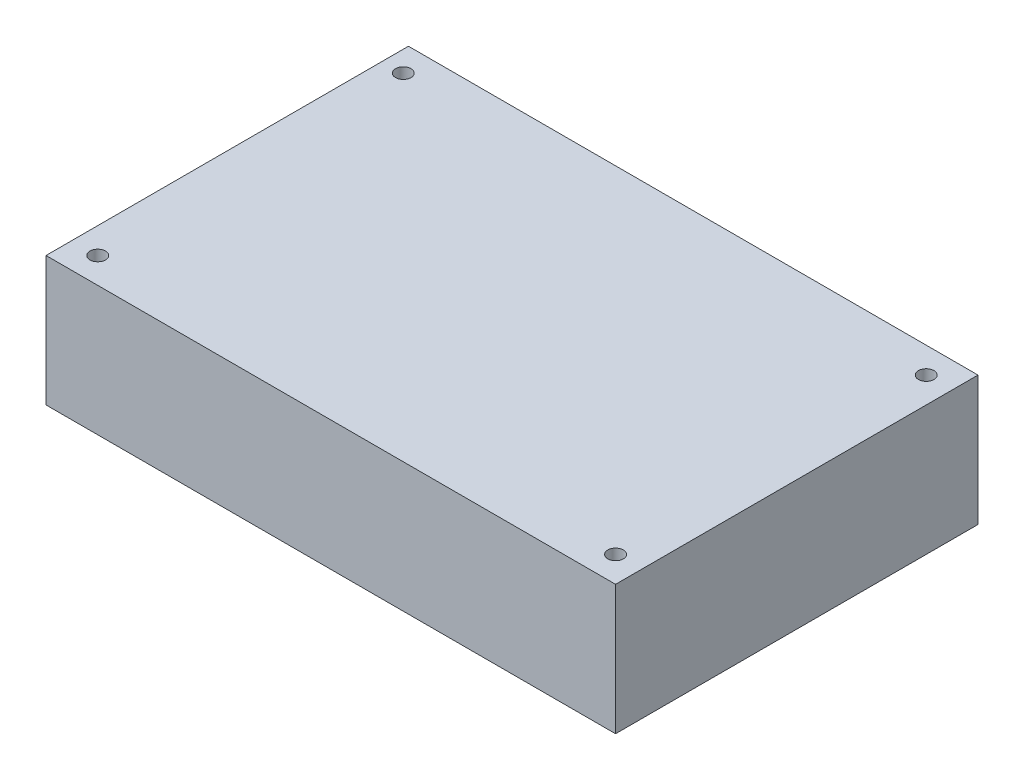
ISO-10303-21;
HEADER;
FILE_DESCRIPTION(('STEP AP214'),'2;1');
FILE_NAME('part.step','',(''),(''),'','','');
FILE_SCHEMA(('AUTOMOTIVE_DESIGN { 1 0 10303 214 1 1 1 1 }'));
ENDSEC;
DATA;
#1=APPLICATION_CONTEXT('core data for automotive mechanical design processes');
#2=APPLICATION_PROTOCOL_DEFINITION('international standard','automotive_design',2000,#1);
#3=PRODUCT_CONTEXT('',#1,'mechanical');
#4=PRODUCT('Part','Part','',(#3));
#5=PRODUCT_RELATED_PRODUCT_CATEGORY('part','',(#4));
#6=PRODUCT_DEFINITION_FORMATION('','',#4);
#7=PRODUCT_DEFINITION_CONTEXT('part definition',#1,'design');
#8=PRODUCT_DEFINITION('design','',#6,#7);
#9=PRODUCT_DEFINITION_SHAPE('','',#8);
#10=(LENGTH_UNIT() NAMED_UNIT(*) SI_UNIT(.MILLI.,.METRE.));
#11=(NAMED_UNIT(*) PLANE_ANGLE_UNIT() SI_UNIT($,.RADIAN.));
#12=(NAMED_UNIT(*) SI_UNIT($,.STERADIAN.) SOLID_ANGLE_UNIT());
#13=UNCERTAINTY_MEASURE_WITH_UNIT(LENGTH_MEASURE(1.E-05),#10,'distance_accuracy_value','');
#14=(GEOMETRIC_REPRESENTATION_CONTEXT(3) GLOBAL_UNCERTAINTY_ASSIGNED_CONTEXT((#13)) GLOBAL_UNIT_ASSIGNED_CONTEXT((#10,
#11,#12)) REPRESENTATION_CONTEXT('',''));
#15=CARTESIAN_POINT('',(0.,0.,0.));
#16=DIRECTION('',(0.,0.,1.));
#17=DIRECTION('',(1.,0.,0.));
#18=AXIS2_PLACEMENT_3D('',#15,#16,#17);
#19=CARTESIAN_POINT('',(0.,25.,0.));
#20=DIRECTION('',(0.,-1.,0.));
#21=DIRECTION('',(0.,0.,-1.));
#22=AXIS2_PLACEMENT_3D('',#19,#20,#21);
#23=PLANE('',#22);
#24=DIRECTION('',(0.,0.,-1.));
#25=VECTOR('',#24,1.);
#26=CARTESIAN_POINT('',(55.,25.,35.));
#27=LINE('',#26,#25);
#28=CARTESIAN_POINT('',(55.,25.,35.));
#29=VERTEX_POINT('',#28);
#30=CARTESIAN_POINT('',(55.,25.,-35.));
#31=VERTEX_POINT('',#30);
#32=EDGE_CURVE('E96',#29,#31,#27,.T.);
#33=ORIENTED_EDGE('',*,*,#32,.T.);
#34=DIRECTION('',(-1.,0.,0.));
#35=VECTOR('',#34,1.);
#36=CARTESIAN_POINT('',(-55.,25.,-35.));
#37=LINE('',#36,#35);
#38=CARTESIAN_POINT('',(-55.,25.,-35.));
#39=VERTEX_POINT('',#38);
#40=EDGE_CURVE('E91',#31,#39,#37,.T.);
#41=ORIENTED_EDGE('',*,*,#40,.T.);
#42=DIRECTION('',(0.,0.,1.));
#43=VECTOR('',#42,1.);
#44=CARTESIAN_POINT('',(-55.,25.,35.));
#45=LINE('',#44,#43);
#46=CARTESIAN_POINT('',(-55.,25.,35.));
#47=VERTEX_POINT('',#46);
#48=EDGE_CURVE('E94',#39,#47,#45,.T.);
#49=ORIENTED_EDGE('',*,*,#48,.T.);
#50=DIRECTION('',(1.,0.,0.));
#51=VECTOR('',#50,1.);
#52=CARTESIAN_POINT('',(-55.,25.,35.));
#53=LINE('',#52,#51);
#54=EDGE_CURVE('E61',#47,#29,#53,.T.);
#55=ORIENTED_EDGE('',*,*,#54,.T.);
#56=EDGE_LOOP('',(#33,#41,#49,#55));
#57=FACE_BOUND('',#56,.T.);
#58=CARTESIAN_POINT('',(-51.,25.,-30.));
#59=DIRECTION('',(0.,1.,0.));
#60=DIRECTION('',(0.,0.,1.));
#61=AXIS2_PLACEMENT_3D('',#58,#59,#60);
#62=CIRCLE('',#61,1.5);
#63=CARTESIAN_POINT('',(-51.,25.,-28.5));
#64=VERTEX_POINT('',#63);
#65=EDGE_CURVE('E116',#64,#64,#62,.T.);
#66=ORIENTED_EDGE('',*,*,#65,.F.);
#67=EDGE_LOOP('',(#66));
#68=FACE_BOUND('',#67,.T.);
#69=CARTESIAN_POINT('',(50.,25.,-30.));
#70=DIRECTION('',(0.,1.,0.));
#71=DIRECTION('',(0.,0.,1.));
#72=AXIS2_PLACEMENT_3D('',#69,#70,#71);
#73=CIRCLE('',#72,1.5);
#74=CARTESIAN_POINT('',(50.,25.,-28.5));
#75=VERTEX_POINT('',#74);
#76=EDGE_CURVE('E138',#75,#75,#73,.T.);
#77=ORIENTED_EDGE('',*,*,#76,.F.);
#78=EDGE_LOOP('',(#77));
#79=FACE_BOUND('',#78,.T.);
#80=CARTESIAN_POINT('',(50.,25.,30.));
#81=DIRECTION('',(0.,1.,0.));
#82=DIRECTION('',(0.,0.,1.));
#83=AXIS2_PLACEMENT_3D('',#80,#81,#82);
#84=CIRCLE('',#83,1.5);
#85=CARTESIAN_POINT('',(50.,25.,31.5));
#86=VERTEX_POINT('',#85);
#87=EDGE_CURVE('E146',#86,#86,#84,.T.);
#88=ORIENTED_EDGE('',*,*,#87,.F.);
#89=EDGE_LOOP('',(#88));
#90=FACE_BOUND('',#89,.T.);
#91=CARTESIAN_POINT('',(-50.,25.,30.));
#92=DIRECTION('',(0.,1.,0.));
#93=DIRECTION('',(0.,0.,1.));
#94=AXIS2_PLACEMENT_3D('',#91,#92,#93);
#95=CIRCLE('',#94,1.5);
#96=CARTESIAN_POINT('',(-50.,25.,31.5));
#97=VERTEX_POINT('',#96);
#98=EDGE_CURVE('E154',#97,#97,#95,.T.);
#99=ORIENTED_EDGE('',*,*,#98,.F.);
#100=EDGE_LOOP('',(#99));
#101=FACE_BOUND('',#100,.T.);
#102=ADVANCED_FACE('F43',(#57,#68,#79,#90,#101),#23,.F.);
#103=CARTESIAN_POINT('',(0.,0.,0.));
#104=DIRECTION('',(0.,-1.,0.));
#105=DIRECTION('',(0.,0.,-1.));
#106=AXIS2_PLACEMENT_3D('',#103,#104,#105);
#107=PLANE('',#106);
#108=CARTESIAN_POINT('',(50.,0.,30.));
#109=DIRECTION('',(0.,1.,0.));
#110=DIRECTION('',(0.,0.,1.));
#111=AXIS2_PLACEMENT_3D('',#108,#109,#110);
#112=CIRCLE('',#111,1.5);
#113=CARTESIAN_POINT('',(50.,0.,31.5));
#114=VERTEX_POINT('',#113);
#115=EDGE_CURVE('E150',#114,#114,#112,.T.);
#116=ORIENTED_EDGE('',*,*,#115,.T.);
#117=EDGE_LOOP('',(#116));
#118=FACE_BOUND('',#117,.T.);
#119=CARTESIAN_POINT('',(-51.,0.,-30.));
#120=DIRECTION('',(0.,1.,0.));
#121=DIRECTION('',(0.,0.,1.));
#122=AXIS2_PLACEMENT_3D('',#119,#120,#121);
#123=CIRCLE('',#122,1.5);
#124=CARTESIAN_POINT('',(-51.,0.,-28.5));
#125=VERTEX_POINT('',#124);
#126=EDGE_CURVE('E134',#125,#125,#123,.T.);
#127=ORIENTED_EDGE('',*,*,#126,.T.);
#128=EDGE_LOOP('',(#127));
#129=FACE_BOUND('',#128,.T.);
#130=DIRECTION('',(0.,0.,-1.));
#131=VECTOR('',#130,1.);
#132=CARTESIAN_POINT('',(55.,0.,35.));
#133=LINE('',#132,#131);
#134=CARTESIAN_POINT('',(55.,0.,35.));
#135=VERTEX_POINT('',#134);
#136=CARTESIAN_POINT('',(55.,0.,-35.));
#137=VERTEX_POINT('',#136);
#138=EDGE_CURVE('E112',#135,#137,#133,.T.);
#139=ORIENTED_EDGE('',*,*,#138,.F.);
#140=DIRECTION('',(1.,0.,0.));
#141=VECTOR('',#140,1.);
#142=CARTESIAN_POINT('',(-55.,0.,35.));
#143=LINE('',#142,#141);
#144=CARTESIAN_POINT('',(-55.,0.,35.));
#145=VERTEX_POINT('',#144);
#146=EDGE_CURVE('E84',#145,#135,#143,.T.);
#147=ORIENTED_EDGE('',*,*,#146,.F.);
#148=DIRECTION('',(0.,0.,1.));
#149=VECTOR('',#148,1.);
#150=CARTESIAN_POINT('',(-55.,0.,35.));
#151=LINE('',#150,#149);
#152=CARTESIAN_POINT('',(-55.,0.,-35.));
#153=VERTEX_POINT('',#152);
#154=EDGE_CURVE('E78',#153,#145,#151,.T.);
#155=ORIENTED_EDGE('',*,*,#154,.F.);
#156=DIRECTION('',(-1.,0.,0.));
#157=VECTOR('',#156,1.);
#158=CARTESIAN_POINT('',(-55.,0.,-35.));
#159=LINE('',#158,#157);
#160=EDGE_CURVE('E101',#137,#153,#159,.T.);
#161=ORIENTED_EDGE('',*,*,#160,.F.);
#162=EDGE_LOOP('',(#139,#147,#155,#161));
#163=FACE_BOUND('',#162,.T.);
#164=CARTESIAN_POINT('',(50.,0.,-30.));
#165=DIRECTION('',(0.,1.,0.));
#166=DIRECTION('',(0.,0.,1.));
#167=AXIS2_PLACEMENT_3D('',#164,#165,#166);
#168=CIRCLE('',#167,1.5);
#169=CARTESIAN_POINT('',(50.,0.,-28.5));
#170=VERTEX_POINT('',#169);
#171=EDGE_CURVE('E142',#170,#170,#168,.T.);
#172=ORIENTED_EDGE('',*,*,#171,.T.);
#173=EDGE_LOOP('',(#172));
#174=FACE_BOUND('',#173,.T.);
#175=CARTESIAN_POINT('',(-50.,0.,30.));
#176=DIRECTION('',(0.,1.,0.));
#177=DIRECTION('',(0.,0.,1.));
#178=AXIS2_PLACEMENT_3D('',#175,#176,#177);
#179=CIRCLE('',#178,1.5);
#180=CARTESIAN_POINT('',(-50.,0.,31.5));
#181=VERTEX_POINT('',#180);
#182=EDGE_CURVE('E158',#181,#181,#179,.T.);
#183=ORIENTED_EDGE('',*,*,#182,.T.);
#184=EDGE_LOOP('',(#183));
#185=FACE_BOUND('',#184,.T.);
#186=ADVANCED_FACE('F129',(#118,#129,#163,#174,#185),#107,.T.);
#187=CARTESIAN_POINT('',(55.,25.,35.));
#188=DIRECTION('',(-1.,0.,0.));
#189=DIRECTION('',(0.,0.,1.));
#190=AXIS2_PLACEMENT_3D('',#187,#188,#189);
#191=PLANE('',#190);
#192=ORIENTED_EDGE('',*,*,#138,.T.);
#193=DIRECTION('',(0.,-1.,0.));
#194=VECTOR('',#193,1.);
#195=CARTESIAN_POINT('',(55.,25.,-35.));
#196=LINE('',#195,#194);
#197=EDGE_CURVE('E11',#31,#137,#196,.T.);
#198=ORIENTED_EDGE('',*,*,#197,.F.);
#199=ORIENTED_EDGE('',*,*,#32,.F.);
#200=DIRECTION('',(0.,-1.,0.));
#201=VECTOR('',#200,1.);
#202=CARTESIAN_POINT('',(55.,25.,35.));
#203=LINE('',#202,#201);
#204=EDGE_CURVE('E108',#29,#135,#203,.T.);
#205=ORIENTED_EDGE('',*,*,#204,.T.);
#206=EDGE_LOOP('',(#192,#198,#199,#205));
#207=FACE_BOUND('',#206,.T.);
#208=ADVANCED_FACE('F45',(#207),#191,.F.);
#209=CARTESIAN_POINT('',(-55.,25.,-35.));
#210=DIRECTION('',(0.,0.,1.));
#211=DIRECTION('',(1.,0.,0.));
#212=AXIS2_PLACEMENT_3D('',#209,#210,#211);
#213=PLANE('',#212);
#214=ORIENTED_EDGE('',*,*,#160,.T.);
#215=DIRECTION('',(0.,-1.,0.));
#216=VECTOR('',#215,1.);
#217=CARTESIAN_POINT('',(-55.,25.,-35.));
#218=LINE('',#217,#216);
#219=EDGE_CURVE('E53',#39,#153,#218,.T.);
#220=ORIENTED_EDGE('',*,*,#219,.F.);
#221=ORIENTED_EDGE('',*,*,#40,.F.);
#222=ORIENTED_EDGE('',*,*,#197,.T.);
#223=EDGE_LOOP('',(#214,#220,#221,#222));
#224=FACE_BOUND('',#223,.T.);
#225=ADVANCED_FACE('F100',(#224),#213,.F.);
#226=CARTESIAN_POINT('',(-55.,25.,35.));
#227=DIRECTION('',(1.,0.,0.));
#228=DIRECTION('',(0.,0.,-1.));
#229=AXIS2_PLACEMENT_3D('',#226,#227,#228);
#230=PLANE('',#229);
#231=ORIENTED_EDGE('',*,*,#154,.T.);
#232=DIRECTION('',(0.,-1.,0.));
#233=VECTOR('',#232,1.);
#234=CARTESIAN_POINT('',(-55.,25.,35.));
#235=LINE('',#234,#233);
#236=EDGE_CURVE('E103',#47,#145,#235,.T.);
#237=ORIENTED_EDGE('',*,*,#236,.F.);
#238=ORIENTED_EDGE('',*,*,#48,.F.);
#239=ORIENTED_EDGE('',*,*,#219,.T.);
#240=EDGE_LOOP('',(#231,#237,#238,#239));
#241=FACE_BOUND('',#240,.T.);
#242=ADVANCED_FACE('F104',(#241),#230,.F.);
#243=CARTESIAN_POINT('',(-55.,25.,35.));
#244=DIRECTION('',(0.,0.,-1.));
#245=DIRECTION('',(-1.,0.,0.));
#246=AXIS2_PLACEMENT_3D('',#243,#244,#245);
#247=PLANE('',#246);
#248=ORIENTED_EDGE('',*,*,#146,.T.);
#249=ORIENTED_EDGE('',*,*,#204,.F.);
#250=ORIENTED_EDGE('',*,*,#54,.F.);
#251=ORIENTED_EDGE('',*,*,#236,.T.);
#252=EDGE_LOOP('',(#248,#249,#250,#251));
#253=FACE_BOUND('',#252,.T.);
#254=ADVANCED_FACE('F126',(#253),#247,.F.);
#255=CARTESIAN_POINT('',(-51.,25.,-30.));
#256=DIRECTION('',(0.,-1.,0.));
#257=DIRECTION('',(0.,0.,-1.));
#258=AXIS2_PLACEMENT_3D('',#255,#256,#257);
#259=CYLINDRICAL_SURFACE('',#258,1.5);
#260=ORIENTED_EDGE('',*,*,#65,.T.);
#261=EDGE_LOOP('',(#260));
#262=FACE_BOUND('',#261,.T.);
#263=ORIENTED_EDGE('',*,*,#126,.F.);
#264=EDGE_LOOP('',(#263));
#265=FACE_BOUND('',#264,.T.);
#266=ADVANCED_FACE('F177',(#262,#265),#259,.F.);
#267=CARTESIAN_POINT('',(50.,25.,-30.));
#268=DIRECTION('',(0.,-1.,0.));
#269=DIRECTION('',(0.,0.,-1.));
#270=AXIS2_PLACEMENT_3D('',#267,#268,#269);
#271=CYLINDRICAL_SURFACE('',#270,1.5);
#272=ORIENTED_EDGE('',*,*,#76,.T.);
#273=EDGE_LOOP('',(#272));
#274=FACE_BOUND('',#273,.T.);
#275=ORIENTED_EDGE('',*,*,#171,.F.);
#276=EDGE_LOOP('',(#275));
#277=FACE_BOUND('',#276,.T.);
#278=ADVANCED_FACE('F231',(#274,#277),#271,.F.);
#279=CARTESIAN_POINT('',(50.,25.,30.));
#280=DIRECTION('',(0.,-1.,0.));
#281=DIRECTION('',(0.,0.,-1.));
#282=AXIS2_PLACEMENT_3D('',#279,#280,#281);
#283=CYLINDRICAL_SURFACE('',#282,1.5);
#284=ORIENTED_EDGE('',*,*,#87,.T.);
#285=EDGE_LOOP('',(#284));
#286=FACE_BOUND('',#285,.T.);
#287=ORIENTED_EDGE('',*,*,#115,.F.);
#288=EDGE_LOOP('',(#287));
#289=FACE_BOUND('',#288,.T.);
#290=ADVANCED_FACE('F240',(#286,#289),#283,.F.);
#291=CARTESIAN_POINT('',(-50.,25.,30.));
#292=DIRECTION('',(0.,-1.,0.));
#293=DIRECTION('',(0.,0.,-1.));
#294=AXIS2_PLACEMENT_3D('',#291,#292,#293);
#295=CYLINDRICAL_SURFACE('',#294,1.5);
#296=ORIENTED_EDGE('',*,*,#98,.T.);
#297=EDGE_LOOP('',(#296));
#298=FACE_BOUND('',#297,.T.);
#299=ORIENTED_EDGE('',*,*,#182,.F.);
#300=EDGE_LOOP('',(#299));
#301=FACE_BOUND('',#300,.T.);
#302=ADVANCED_FACE('F166',(#298,#301),#295,.F.);
#303=CLOSED_SHELL('',(#102,#186,#208,#225,#242,#254,#266,#278,#290,#302));
#304=MANIFOLD_SOLID_BREP('B2',#303);
#305=ADVANCED_BREP_SHAPE_REPRESENTATION('',(#18,#304),#14);
#306=SHAPE_DEFINITION_REPRESENTATION(#9,#305);
ENDSEC;
END-ISO-10303-21;
